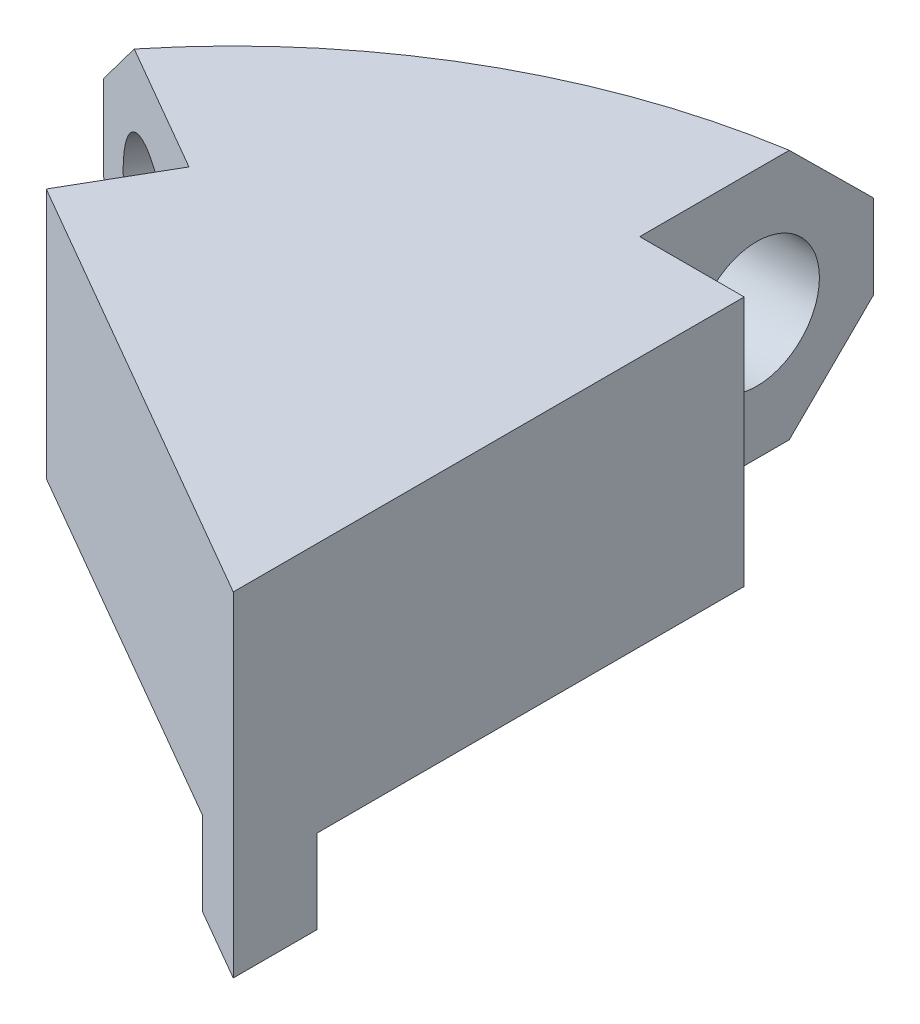
ISO-10303-21;
HEADER;
FILE_DESCRIPTION(('STEP AP214'),'2;1');
FILE_NAME('part.step','',(''),(''),'','','');
FILE_SCHEMA(('AUTOMOTIVE_DESIGN { 1 0 10303 214 1 1 1 1 }'));
ENDSEC;
DATA;
#1=APPLICATION_CONTEXT('core data for automotive mechanical design processes');
#2=APPLICATION_PROTOCOL_DEFINITION('international standard','automotive_design',2000,#1);
#3=PRODUCT_CONTEXT('',#1,'mechanical');
#4=PRODUCT('Part','Part','',(#3));
#5=PRODUCT_RELATED_PRODUCT_CATEGORY('part','',(#4));
#6=PRODUCT_DEFINITION_FORMATION('','',#4);
#7=PRODUCT_DEFINITION_CONTEXT('part definition',#1,'design');
#8=PRODUCT_DEFINITION('design','',#6,#7);
#9=PRODUCT_DEFINITION_SHAPE('','',#8);
#10=(LENGTH_UNIT() NAMED_UNIT(*) SI_UNIT(.MILLI.,.METRE.));
#11=(NAMED_UNIT(*) PLANE_ANGLE_UNIT() SI_UNIT($,.RADIAN.));
#12=(NAMED_UNIT(*) SI_UNIT($,.STERADIAN.) SOLID_ANGLE_UNIT());
#13=UNCERTAINTY_MEASURE_WITH_UNIT(LENGTH_MEASURE(1.E-05),#10,'distance_accuracy_value','');
#14=(GEOMETRIC_REPRESENTATION_CONTEXT(3) GLOBAL_UNCERTAINTY_ASSIGNED_CONTEXT((#13)) GLOBAL_UNIT_ASSIGNED_CONTEXT((#10,
#11,#12)) REPRESENTATION_CONTEXT('',''));
#15=CARTESIAN_POINT('',(0.,0.,0.));
#16=DIRECTION('',(0.,0.,1.));
#17=DIRECTION('',(1.,0.,0.));
#18=AXIS2_PLACEMENT_3D('',#15,#16,#17);
#19=CARTESIAN_POINT('',(-78.3053592074122,15.,-96.422169107235));
#20=DIRECTION('',(0.,0.,1.));
#21=DIRECTION('',(1.,0.,0.));
#22=AXIS2_PLACEMENT_3D('',#19,#20,#21);
#23=PLANE('',#22);
#24=DIRECTION('',(-1.,0.,0.));
#25=VECTOR('',#24,1.);
#26=CARTESIAN_POINT('',(-65.8053592074117,15.,-96.422169107235));
#27=LINE('',#26,#25);
#28=CARTESIAN_POINT('',(-65.8053592074122,15.,-96.422169107235));
#29=VERTEX_POINT('',#28);
#30=CARTESIAN_POINT('',(-78.3053592074122,15.,-96.422169107235));
#31=VERTEX_POINT('',#30);
#32=EDGE_CURVE('E205',#29,#31,#27,.T.);
#33=ORIENTED_EDGE('',*,*,#32,.F.);
#34=DIRECTION('',(0.,1.,0.));
#35=VECTOR('',#34,1.);
#36=CARTESIAN_POINT('',(-65.8053592074122,-15.,-96.422169107235));
#37=LINE('',#36,#35);
#38=CARTESIAN_POINT('',(-65.8053592074122,-15.,-96.422169107235));
#39=VERTEX_POINT('',#38);
#40=EDGE_CURVE('E189',#39,#29,#37,.T.);
#41=ORIENTED_EDGE('',*,*,#40,.F.);
#42=DIRECTION('',(-1.,0.,0.));
#43=VECTOR('',#42,1.);
#44=CARTESIAN_POINT('',(-78.3053592074122,-15.,-96.422169107235));
#45=LINE('',#44,#43);
#46=CARTESIAN_POINT('',(-78.3053592074122,-15.,-96.422169107235));
#47=VERTEX_POINT('',#46);
#48=EDGE_CURVE('E199',#39,#47,#45,.T.);
#49=ORIENTED_EDGE('',*,*,#48,.T.);
#50=DIRECTION('',(0.,-1.,0.));
#51=VECTOR('',#50,1.);
#52=CARTESIAN_POINT('',(-78.3053592074122,15.,-96.422169107235));
#53=LINE('',#52,#51);
#54=EDGE_CURVE('E242',#31,#47,#53,.T.);
#55=ORIENTED_EDGE('',*,*,#54,.F.);
#56=EDGE_LOOP('',(#33,#41,#49,#55));
#57=FACE_BOUND('',#56,.T.);
#58=ADVANCED_FACE('F46',(#57),#23,.F.);
#59=CARTESIAN_POINT('',(-78.3053592074123,15.,-124.422169107236));
#60=DIRECTION('',(-1.,0.,0.));
#61=DIRECTION('',(0.,0.,1.));
#62=AXIS2_PLACEMENT_3D('',#59,#60,#61);
#63=PLANE('',#62);
#64=CARTESIAN_POINT('',(-78.3053592074147,0.,-110.422169107236));
#65=DIRECTION('',(1.,0.,0.));
#66=DIRECTION('',(0.,0.,-1.));
#67=AXIS2_PLACEMENT_3D('',#64,#65,#66);
#68=CIRCLE('',#67,7.5);
#69=CARTESIAN_POINT('',(-78.305359207415,0.,-117.922169107236));
#70=VERTEX_POINT('',#69);
#71=EDGE_CURVE('E173',#70,#70,#68,.T.);
#72=ORIENTED_EDGE('',*,*,#71,.F.);
#73=EDGE_LOOP('',(#72));
#74=FACE_BOUND('',#73,.T.);
#75=DIRECTION('',(0.,-1.,0.));
#76=VECTOR('',#75,1.);
#77=CARTESIAN_POINT('',(-78.3053592074123,15.,-124.422169107236));
#78=LINE('',#77,#76);
#79=CARTESIAN_POINT('',(-78.3053592074123,5.00000000000003,-124.422169107236));
#80=VERTEX_POINT('',#79);
#81=CARTESIAN_POINT('',(-78.3053592074123,-5.00000000000001,-124.422169107236));
#82=VERTEX_POINT('',#81);
#83=EDGE_CURVE('E239',#80,#82,#78,.T.);
#84=ORIENTED_EDGE('',*,*,#83,.F.);
#85=CARTESIAN_POINT('',(-78.3053592074123,5.00000000000003,-124.422169107236));
#86=CARTESIAN_POINT('',(-78.3053592074123,5.83385171149264,-123.580155776792));
#87=CARTESIAN_POINT('',(-78.3053592074123,6.66758915341757,-122.73802927145));
#88=CARTESIAN_POINT('',(-78.3053592074123,8.33481298739111,-121.053527965679));
#89=CARTESIAN_POINT('',(-78.3053592074123,9.16829937946647,-120.211153165275));
#90=CARTESIAN_POINT('',(-78.3053592074123,10.8349987950787,-118.526133130131));
#91=CARTESIAN_POINT('',(-78.3053592074123,11.6682118186108,-117.683487895386));
#92=CARTESIAN_POINT('',(-78.3053592074123,13.3343377368465,-115.997900587824));
#93=CARTESIAN_POINT('',(-78.3053592074123,14.1672506315182,-115.154958514976));
#94=CARTESIAN_POINT('',(-78.3053592074123,15.,-114.311854903752));
#95=B_SPLINE_CURVE_WITH_KNOTS('',3,(#85,#86,#87,#88,#89,#90,#91,#92,#93,#94),.UNSPECIFIED.,.F.,
.F.,(4,2,2,2,4),(0.,3.55508876748459,7.11017715619762,10.6652656062827,14.2203544352882),.UNSPECIFIED.);
#96=CARTESIAN_POINT('',(-78.3053592074123,15.,-114.311854903752));
#97=VERTEX_POINT('',#96);
#98=EDGE_CURVE('E11',#80,#97,#95,.T.);
#99=ORIENTED_EDGE('',*,*,#98,.T.);
#100=DIRECTION('',(0.,0.,-1.));
#101=VECTOR('',#100,1.);
#102=CARTESIAN_POINT('',(-78.3053592074123,15.,-124.422169107236));
#103=LINE('',#102,#101);
#104=EDGE_CURVE('E208',#31,#97,#103,.T.);
#105=ORIENTED_EDGE('',*,*,#104,.F.);
#106=ORIENTED_EDGE('',*,*,#54,.T.);
#107=DIRECTION('',(0.,0.,-1.));
#108=VECTOR('',#107,1.);
#109=CARTESIAN_POINT('',(-78.3053592074123,-15.,-124.422169107236));
#110=LINE('',#109,#108);
#111=CARTESIAN_POINT('',(-78.3053592074123,-15.,-114.311854903752));
#112=VERTEX_POINT('',#111);
#113=EDGE_CURVE('E223',#47,#112,#110,.T.);
#114=ORIENTED_EDGE('',*,*,#113,.T.);
#115=CARTESIAN_POINT('',(-78.3053592074123,-15.,-114.311854903752));
#116=CARTESIAN_POINT('',(-78.3053592074123,-14.1672506315182,-115.154958514976));
#117=CARTESIAN_POINT('',(-78.3053592074123,-13.3343377368466,-115.997900587824));
#118=CARTESIAN_POINT('',(-78.3053592074123,-11.6682118186108,-117.683487895386));
#119=CARTESIAN_POINT('',(-78.3053592074123,-10.8349987950786,-118.526133130131));
#120=CARTESIAN_POINT('',(-78.3053592074123,-9.16829937946645,-120.211153165275));
#121=CARTESIAN_POINT('',(-78.3053592074123,-8.3348129873911,-121.053527965679));
#122=CARTESIAN_POINT('',(-78.3053592074123,-6.66758915341755,-122.73802927145));
#123=CARTESIAN_POINT('',(-78.3053592074123,-5.83385171149262,-123.580155776792));
#124=CARTESIAN_POINT('',(-78.3053592074123,-5.00000000000001,-124.422169107236));
#125=B_SPLINE_CURVE_WITH_KNOTS('',3,(#115,#116,#117,#118,#119,#120,#121,#122,#123,#124),
.UNSPECIFIED.,.F.,.F.,(4,2,2,2,4),(0.,3.55508882900547,7.1101772790906,10.6652656678037,
14.2203544352883),.UNSPECIFIED.);
#126=EDGE_CURVE('E286',#112,#82,#125,.T.);
#127=ORIENTED_EDGE('',*,*,#126,.T.);
#128=EDGE_LOOP('',(#84,#99,#105,#106,#114,#127));
#129=FACE_BOUND('',#128,.T.);
#130=ADVANCED_FACE('F300',(#74,#129),#63,.F.);
#131=CARTESIAN_POINT('',(-65.805359207412,15.,-35.2944517573555));
#132=DIRECTION('',(0.,-1.,0.));
#133=DIRECTION('',(0.,0.,-1.));
#134=AXIS2_PLACEMENT_3D('',#131,#132,#133);
#135=CYLINDRICAL_SURFACE('',#134,90.0000000000009);
#136=DIRECTION('',(0.,-1.,0.));
#137=VECTOR('',#136,1.);
#138=CARTESIAN_POINT('',(-136.742226613727,15.,-90.6836279796011));
#139=LINE('',#138,#137);
#140=CARTESIAN_POINT('',(-136.742226613727,5.00000000000003,-90.6836279796011));
#141=VERTEX_POINT('',#140);
#142=CARTESIAN_POINT('',(-136.742226613727,-5.00000000000001,-90.6836279796011));
#143=VERTEX_POINT('',#142);
#144=EDGE_CURVE('E236',#141,#143,#139,.T.);
#145=ORIENTED_EDGE('',*,*,#144,.F.);
#146=CARTESIAN_POINT('',(-65.805359207412,5.00000000000003,-35.2944517573555));
#147=DIRECTION('',(0.,1.,0.));
#148=DIRECTION('',(0.,0.,1.));
#149=AXIS2_PLACEMENT_3D('',#146,#147,#148);
#150=CIRCLE('',#149,90.0000000000009);
#151=EDGE_CURVE('E62',#141,#80,#150,.F.);
#152=ORIENTED_EDGE('',*,*,#151,.T.);
#153=ORIENTED_EDGE('',*,*,#83,.T.);
#154=CARTESIAN_POINT('',(-65.805359207412,-5.00000000000001,-35.2944517573555));
#155=DIRECTION('',(0.,1.,0.));
#156=DIRECTION('',(0.,0.,1.));
#157=AXIS2_PLACEMENT_3D('',#154,#155,#156);
#158=CIRCLE('',#157,90.0000000000009);
#159=EDGE_CURVE('E246',#82,#143,#158,.T.);
#160=ORIENTED_EDGE('',*,*,#159,.T.);
#161=EDGE_LOOP('',(#145,#152,#153,#160));
#162=FACE_BOUND('',#161,.T.);
#163=ADVANCED_FACE('F270',(#162),#135,.T.);
#164=CARTESIAN_POINT('',(-112.493515307762,15.,-76.6836279796008));
#165=DIRECTION('',(0.499999999999997,0.,-0.86602540378444));
#166=DIRECTION('',(-0.86602540378444,0.,-0.499999999999997));
#167=AXIS2_PLACEMENT_3D('',#164,#165,#166);
#168=PLANE('',#167);
#169=CARTESIAN_POINT('',(-124.617870960745,0.,-83.683627979601));
#170=DIRECTION('',(-0.499999999999997,0.,0.86602540378444));
#171=DIRECTION('',(0.86602540378444,0.,0.499999999999997));
#172=AXIS2_PLACEMENT_3D('',#169,#170,#171);
#173=CIRCLE('',#172,7.50000000000003);
#174=CARTESIAN_POINT('',(-118.122680432362,0.,-79.933627979601));
#175=VERTEX_POINT('',#174);
#176=EDGE_CURVE('E161',#175,#175,#173,.T.);
#177=ORIENTED_EDGE('',*,*,#176,.F.);
#178=EDGE_LOOP('',(#177));
#179=FACE_BOUND('',#178,.T.);
#180=DIRECTION('',(0.86602540378444,0.,0.499999999999997));
#181=VECTOR('',#180,1.);
#182=CARTESIAN_POINT('',(-112.493515307762,15.,-76.6836279796008));
#183=LINE('',#182,#181);
#184=CARTESIAN_POINT('',(-127.986437673268,15.,-85.6284708778592));
#185=VERTEX_POINT('',#184);
#186=CARTESIAN_POINT('',(-112.493515307762,15.,-76.6836279796008));
#187=VERTEX_POINT('',#186);
#188=EDGE_CURVE('E213',#185,#187,#183,.T.);
#189=ORIENTED_EDGE('',*,*,#188,.F.);
#190=CARTESIAN_POINT('',(-127.986437673268,15.,-85.6284708778592));
#191=CARTESIAN_POINT('',(-128.71658681861,14.1672506315182,-86.0500226834713));
#192=CARTESIAN_POINT('',(-129.446596067615,13.3343377368466,-86.4714937198953));
#193=CARTESIAN_POINT('',(-130.90635749626,11.6682118186108,-87.3142873736762));
#194=CARTESIAN_POINT('',(-131.636109675928,10.8349987950787,-87.7356099910489));
#195=CARTESIAN_POINT('',(-133.095379832249,9.16829937946648,-88.578120008621));
#196=CARTESIAN_POINT('',(-133.824897808906,8.33481298739112,-88.9993074088227));
#197=CARTESIAN_POINT('',(-135.283718732412,6.66758915341757,-89.8415580617085));
#198=CARTESIAN_POINT('',(-136.013021679238,5.83385171149264,-90.2626213143793));
#199=CARTESIAN_POINT('',(-136.742226613727,5.00000000000004,-90.6836279796011));
#200=B_SPLINE_CURVE_WITH_KNOTS('',3,(#190,#191,#192,#193,#194,#195,#196,#197,#198,#199),
.UNSPECIFIED.,.F.,.F.,(4,2,2,2,4),(0.,3.55508882900546,7.11017727909057,10.6652656678036,
14.2203544352882),.UNSPECIFIED.);
#201=EDGE_CURVE('E76',#185,#141,#200,.T.);
#202=ORIENTED_EDGE('',*,*,#201,.T.);
#203=ORIENTED_EDGE('',*,*,#144,.T.);
#204=CARTESIAN_POINT('',(-136.742226613727,-5.00000000000001,-90.6836279796011));
#205=CARTESIAN_POINT('',(-136.013021679238,-5.83385171149262,-90.2626213143793));
#206=CARTESIAN_POINT('',(-135.283718732412,-6.66758915341755,-89.8415580617085));
#207=CARTESIAN_POINT('',(-133.824897808906,-8.3348129873911,-88.9993074088227));
#208=CARTESIAN_POINT('',(-133.095379832248,-9.16829937946645,-88.578120008621));
#209=CARTESIAN_POINT('',(-131.636109675928,-10.8349987950786,-87.7356099910489));
#210=CARTESIAN_POINT('',(-130.90635749626,-11.6682118186108,-87.3142873736762));
#211=CARTESIAN_POINT('',(-129.446596067615,-13.3343377368465,-86.4714937198952));
#212=CARTESIAN_POINT('',(-128.71658681861,-14.1672506315182,-86.0500226834713));
#213=CARTESIAN_POINT('',(-127.986437673268,-15.,-85.6284708778592));
#214=B_SPLINE_CURVE_WITH_KNOTS('',3,(#204,#205,#206,#207,#208,#209,#210,#211,#212,#213),
.UNSPECIFIED.,.F.,.F.,(4,2,2,2,4),(0.,3.5550887674846,7.11017715619764,10.6652656062828,
14.2203544352882),.UNSPECIFIED.);
#215=CARTESIAN_POINT('',(-127.986437673268,-15.,-85.6284708778592));
#216=VERTEX_POINT('',#215);
#217=EDGE_CURVE('E250',#143,#216,#214,.T.);
#218=ORIENTED_EDGE('',*,*,#217,.T.);
#219=DIRECTION('',(0.86602540378444,0.,0.499999999999997));
#220=VECTOR('',#219,1.);
#221=CARTESIAN_POINT('',(-112.493515307762,-15.,-76.6836279796008));
#222=LINE('',#221,#220);
#223=CARTESIAN_POINT('',(-112.493515307762,-15.,-76.6836279796008));
#224=VERTEX_POINT('',#223);
#225=EDGE_CURVE('E227',#216,#224,#222,.T.);
#226=ORIENTED_EDGE('',*,*,#225,.T.);
#227=DIRECTION('',(0.,-1.,0.));
#228=VECTOR('',#227,1.);
#229=CARTESIAN_POINT('',(-112.493515307762,15.,-76.6836279796008));
#230=LINE('',#229,#228);
#231=EDGE_CURVE('E220',#187,#224,#230,.T.);
#232=ORIENTED_EDGE('',*,*,#231,.F.);
#233=EDGE_LOOP('',(#189,#202,#203,#218,#226,#232));
#234=FACE_BOUND('',#233,.T.);
#235=ADVANCED_FACE('F264',(#179,#234),#168,.F.);
#236=CARTESIAN_POINT('',(-124.993515307762,15.,-55.0329928849898));
#237=DIRECTION('',(0.866025403784439,0.,0.5));
#238=DIRECTION('',(0.5,0.,-0.866025403784439));
#239=AXIS2_PLACEMENT_3D('',#236,#237,#238);
#240=PLANE('',#239);
#241=DIRECTION('',(-0.5,0.,0.866025403784439));
#242=VECTOR('',#241,1.);
#243=CARTESIAN_POINT('',(-124.993515307762,-15.,-55.0329928849898));
#244=LINE('',#243,#242);
#245=CARTESIAN_POINT('',(-118.743515307762,-15.,-65.8583104322953));
#246=VERTEX_POINT('',#245);
#247=EDGE_CURVE('E209',#224,#246,#244,.T.);
#248=ORIENTED_EDGE('',*,*,#247,.T.);
#249=DIRECTION('',(0.,1.,0.));
#250=VECTOR('',#249,1.);
#251=CARTESIAN_POINT('',(-118.743515307762,-15.,-65.8583104322953));
#252=LINE('',#251,#250);
#253=CARTESIAN_POINT('',(-118.743515307762,15.,-65.8583104322953));
#254=VERTEX_POINT('',#253);
#255=EDGE_CURVE('E195',#246,#254,#252,.T.);
#256=ORIENTED_EDGE('',*,*,#255,.T.);
#257=DIRECTION('',(-0.500000000000001,0.,0.866025403784438));
#258=VECTOR('',#257,1.);
#259=CARTESIAN_POINT('',(-118.743515307762,15.,-65.8583104322953));
#260=LINE('',#259,#258);
#261=EDGE_CURVE('E216',#187,#254,#260,.T.);
#262=ORIENTED_EDGE('',*,*,#261,.F.);
#263=ORIENTED_EDGE('',*,*,#231,.T.);
#264=EDGE_LOOP('',(#248,#256,#262,#263));
#265=FACE_BOUND('',#264,.T.);
#266=ADVANCED_FACE('F269',(#265),#240,.F.);
#267=CARTESIAN_POINT('',(-65.805359207412,15.,-35.2944517573555));
#268=DIRECTION('',(0.,1.,0.));
#269=DIRECTION('',(0.,0.,1.));
#270=AXIS2_PLACEMENT_3D('',#267,#268,#269);
#271=PLANE('',#270);
#272=ORIENTED_EDGE('',*,*,#104,.T.);
#273=CARTESIAN_POINT('',(-65.805359207412,15.,-35.2944517573555));
#274=DIRECTION('',(0.,1.,0.));
#275=DIRECTION('',(0.,0.,1.));
#276=AXIS2_PLACEMENT_3D('',#273,#274,#275);
#277=CIRCLE('',#276,80.0000000000009);
#278=EDGE_CURVE('E281',#97,#185,#277,.T.);
#279=ORIENTED_EDGE('',*,*,#278,.T.);
#280=ORIENTED_EDGE('',*,*,#188,.T.);
#281=ORIENTED_EDGE('',*,*,#261,.T.);
#282=DIRECTION('',(-0.86602540378444,0.,-0.499999999999997));
#283=VECTOR('',#282,1.);
#284=CARTESIAN_POINT('',(-118.743515307762,15.,-65.8583104322953));
#285=LINE('',#284,#283);
#286=CARTESIAN_POINT('',(-65.8053592074122,15.,-35.2944517573559));
#287=VERTEX_POINT('',#286);
#288=EDGE_CURVE('E186',#287,#254,#285,.T.);
#289=ORIENTED_EDGE('',*,*,#288,.F.);
#290=DIRECTION('',(0.,0.,1.));
#291=VECTOR('',#290,1.);
#292=CARTESIAN_POINT('',(-65.8053592074122,15.,-96.422169107235));
#293=LINE('',#292,#291);
#294=EDGE_CURVE('E179',#29,#287,#293,.T.);
#295=ORIENTED_EDGE('',*,*,#294,.F.);
#296=ORIENTED_EDGE('',*,*,#32,.T.);
#297=EDGE_LOOP('',(#272,#279,#280,#281,#289,#295,#296));
#298=FACE_BOUND('',#297,.T.);
#299=ADVANCED_FACE('F308',(#298),#271,.T.);
#300=CARTESIAN_POINT('',(-65.805359207412,-15.,-35.2944517573555));
#301=DIRECTION('',(0.,1.,0.));
#302=DIRECTION('',(0.,0.,1.));
#303=AXIS2_PLACEMENT_3D('',#300,#301,#302);
#304=PLANE('',#303);
#305=ORIENTED_EDGE('',*,*,#225,.F.);
#306=CARTESIAN_POINT('',(-65.805359207412,-15.,-35.2944517573555));
#307=DIRECTION('',(0.,1.,0.));
#308=DIRECTION('',(0.,0.,1.));
#309=AXIS2_PLACEMENT_3D('',#306,#307,#308);
#310=CIRCLE('',#309,80.0000000000008);
#311=EDGE_CURVE('E258',#216,#112,#310,.F.);
#312=ORIENTED_EDGE('',*,*,#311,.T.);
#313=ORIENTED_EDGE('',*,*,#113,.F.);
#314=ORIENTED_EDGE('',*,*,#48,.F.);
#315=DIRECTION('',(0.,0.,1.));
#316=VECTOR('',#315,1.);
#317=CARTESIAN_POINT('',(-65.8053592074122,-15.,-96.422169107235));
#318=LINE('',#317,#316);
#319=CARTESIAN_POINT('',(-65.8053592074122,-15.,-45.2944517573559));
#320=VERTEX_POINT('',#319);
#321=EDGE_CURVE('E183',#39,#320,#318,.T.);
#322=ORIENTED_EDGE('',*,*,#321,.T.);
#323=CARTESIAN_POINT('',(-65.8053592074122,-15.,-35.2944517573559));
#324=DIRECTION('',(0.,-1.,0.));
#325=DIRECTION('',(0.,0.,-1.));
#326=AXIS2_PLACEMENT_3D('',#323,#324,#325);
#327=CIRCLE('',#326,10.);
#328=CARTESIAN_POINT('',(-74.4656132452565,-15.,-40.2944517573559));
#329=VERTEX_POINT('',#328);
#330=EDGE_CURVE('E154',#329,#320,#327,.T.);
#331=ORIENTED_EDGE('',*,*,#330,.F.);
#332=DIRECTION('',(-0.86602540378444,0.,-0.499999999999997));
#333=VECTOR('',#332,1.);
#334=CARTESIAN_POINT('',(-118.743515307762,-15.,-65.8583104322953));
#335=LINE('',#334,#333);
#336=EDGE_CURVE('E159',#329,#246,#335,.T.);
#337=ORIENTED_EDGE('',*,*,#336,.T.);
#338=ORIENTED_EDGE('',*,*,#247,.F.);
#339=EDGE_LOOP('',(#305,#312,#313,#314,#322,#331,#337,#338));
#340=FACE_BOUND('',#339,.T.);
#341=ADVANCED_FACE('F293',(#340),#304,.F.);
#342=CARTESIAN_POINT('',(-118.743515307762,-15.,-65.8583104322953));
#343=DIRECTION('',(0.499999999999997,0.,-0.86602540378444));
#344=DIRECTION('',(-0.86602540378444,0.,-0.499999999999997));
#345=AXIS2_PLACEMENT_3D('',#342,#343,#344);
#346=PLANE('',#345);
#347=ORIENTED_EDGE('',*,*,#288,.T.);
#348=ORIENTED_EDGE('',*,*,#255,.F.);
#349=ORIENTED_EDGE('',*,*,#336,.F.);
#350=DIRECTION('',(0.,1.,0.));
#351=VECTOR('',#350,1.);
#352=CARTESIAN_POINT('',(-74.4656132452565,-25.,-40.2944517573559));
#353=LINE('',#352,#351);
#354=CARTESIAN_POINT('',(-74.4656132452565,-25.,-40.2944517573559));
#355=VERTEX_POINT('',#354);
#356=EDGE_CURVE('E140',#355,#329,#353,.T.);
#357=ORIENTED_EDGE('',*,*,#356,.F.);
#358=DIRECTION('',(-0.866025403784439,0.,-0.5));
#359=VECTOR('',#358,1.);
#360=CARTESIAN_POINT('',(-65.8053592074122,-25.,-35.2944517573559));
#361=LINE('',#360,#359);
#362=CARTESIAN_POINT('',(-65.8053592074122,-25.,-35.2944517573559));
#363=VERTEX_POINT('',#362);
#364=EDGE_CURVE('E148',#363,#355,#361,.T.);
#365=ORIENTED_EDGE('',*,*,#364,.F.);
#366=DIRECTION('',(0.,1.,0.));
#367=VECTOR('',#366,1.);
#368=CARTESIAN_POINT('',(-65.8053592074122,-15.,-35.2944517573559));
#369=LINE('',#368,#367);
#370=EDGE_CURVE('E200',#363,#287,#369,.T.);
#371=ORIENTED_EDGE('',*,*,#370,.T.);
#372=EDGE_LOOP('',(#347,#348,#349,#357,#365,#371));
#373=FACE_BOUND('',#372,.T.);
#374=ADVANCED_FACE('F157',(#373),#346,.F.);
#375=CARTESIAN_POINT('',(-65.8053592074122,-15.,-96.422169107235));
#376=DIRECTION('',(-1.,0.,0.));
#377=DIRECTION('',(0.,0.,1.));
#378=AXIS2_PLACEMENT_3D('',#375,#376,#377);
#379=PLANE('',#378);
#380=ORIENTED_EDGE('',*,*,#294,.T.);
#381=ORIENTED_EDGE('',*,*,#370,.F.);
#382=DIRECTION('',(0.,0.,-1.));
#383=VECTOR('',#382,1.);
#384=CARTESIAN_POINT('',(-65.8053592074122,-25.,-35.2944517573559));
#385=LINE('',#384,#383);
#386=CARTESIAN_POINT('',(-65.8053592074122,-25.,-45.2944517573559));
#387=VERTEX_POINT('',#386);
#388=EDGE_CURVE('E147',#363,#387,#385,.T.);
#389=ORIENTED_EDGE('',*,*,#388,.T.);
#390=DIRECTION('',(0.,1.,0.));
#391=VECTOR('',#390,1.);
#392=CARTESIAN_POINT('',(-65.8053592074122,-25.,-45.2944517573559));
#393=LINE('',#392,#391);
#394=EDGE_CURVE('E142',#387,#320,#393,.T.);
#395=ORIENTED_EDGE('',*,*,#394,.T.);
#396=ORIENTED_EDGE('',*,*,#321,.F.);
#397=ORIENTED_EDGE('',*,*,#40,.T.);
#398=EDGE_LOOP('',(#380,#381,#389,#395,#396,#397));
#399=FACE_BOUND('',#398,.T.);
#400=ADVANCED_FACE('F316',(#399),#379,.F.);
#401=CARTESIAN_POINT('',(-91.3053592074147,0.,-110.422169107236));
#402=DIRECTION('',(1.,0.,0.));
#403=DIRECTION('',(0.,0.,-1.));
#404=AXIS2_PLACEMENT_3D('',#401,#402,#403);
#405=CYLINDRICAL_SURFACE('',#404,7.5);
#406=CARTESIAN_POINT('',(-91.3053592074147,0.,-110.422169107236));
#407=DIRECTION('',(1.,0.,0.));
#408=DIRECTION('',(0.,0.,-1.));
#409=AXIS2_PLACEMENT_3D('',#406,#407,#408);
#410=CIRCLE('',#409,7.5);
#411=CARTESIAN_POINT('',(-91.3053592074149,0.,-117.922169107236));
#412=VERTEX_POINT('',#411);
#413=EDGE_CURVE('E175',#412,#412,#410,.T.);
#414=CARTESIAN_POINT('',(-91.3053592074149,0.,-117.922169107236));
#415=CARTESIAN_POINT('',(-91.1699425407483,0.,-117.922169107236));
#416=CARTESIAN_POINT('',(-91.0345258740816,0.,-117.922169107236));
#417=CARTESIAN_POINT('',(-90.7636925407483,0.,-117.922169107236));
#418=CARTESIAN_POINT('',(-90.6282758740816,0.,-117.922169107236));
#419=CARTESIAN_POINT('',(-90.3574425407483,0.,-117.922169107236));
#420=CARTESIAN_POINT('',(-90.2220258740816,0.,-117.922169107236));
#421=CARTESIAN_POINT('',(-89.9511925407483,0.,-117.922169107236));
#422=CARTESIAN_POINT('',(-89.8157758740816,0.,-117.922169107236));
#423=CARTESIAN_POINT('',(-89.5449425407483,0.,-117.922169107236));
#424=CARTESIAN_POINT('',(-89.4095258740816,0.,-117.922169107236));
#425=CARTESIAN_POINT('',(-89.1386925407483,0.,-117.922169107236));
#426=CARTESIAN_POINT('',(-89.0032758740816,0.,-117.922169107236));
#427=CARTESIAN_POINT('',(-88.7324425407483,0.,-117.922169107236));
#428=CARTESIAN_POINT('',(-88.5970258740816,0.,-117.922169107236));
#429=CARTESIAN_POINT('',(-88.3261925407483,0.,-117.922169107236));
#430=CARTESIAN_POINT('',(-88.1907758740816,0.,-117.922169107236));
#431=CARTESIAN_POINT('',(-87.9199425407483,0.,-117.922169107236));
#432=CARTESIAN_POINT('',(-87.7845258740816,0.,-117.922169107236));
#433=CARTESIAN_POINT('',(-87.5136925407483,0.,-117.922169107236));
#434=CARTESIAN_POINT('',(-87.3782758740816,0.,-117.922169107236));
#435=CARTESIAN_POINT('',(-87.1074425407483,0.,-117.922169107236));
#436=CARTESIAN_POINT('',(-86.9720258740816,0.,-117.922169107236));
#437=CARTESIAN_POINT('',(-86.7011925407483,0.,-117.922169107236));
#438=CARTESIAN_POINT('',(-86.5657758740816,0.,-117.922169107236));
#439=CARTESIAN_POINT('',(-86.2949425407483,0.,-117.922169107236));
#440=CARTESIAN_POINT('',(-86.1595258740816,0.,-117.922169107236));
#441=CARTESIAN_POINT('',(-85.8886925407483,0.,-117.922169107236));
#442=CARTESIAN_POINT('',(-85.7532758740816,0.,-117.922169107236));
#443=CARTESIAN_POINT('',(-85.4824425407483,0.,-117.922169107236));
#444=CARTESIAN_POINT('',(-85.3470258740816,0.,-117.922169107236));
#445=CARTESIAN_POINT('',(-85.0761925407483,0.,-117.922169107236));
#446=CARTESIAN_POINT('',(-84.9407758740816,0.,-117.922169107236));
#447=CARTESIAN_POINT('',(-84.6699425407483,0.,-117.922169107236));
#448=CARTESIAN_POINT('',(-84.5345258740816,0.,-117.922169107236));
#449=CARTESIAN_POINT('',(-84.2636925407483,0.,-117.922169107236));
#450=CARTESIAN_POINT('',(-84.1282758740816,0.,-117.922169107236));
#451=CARTESIAN_POINT('',(-83.8574425407483,0.,-117.922169107236));
#452=CARTESIAN_POINT('',(-83.7220258740816,0.,-117.922169107236));
#453=CARTESIAN_POINT('',(-83.4511925407483,0.,-117.922169107236));
#454=CARTESIAN_POINT('',(-83.3157758740816,0.,-117.922169107236));
#455=CARTESIAN_POINT('',(-83.0449425407483,0.,-117.922169107236));
#456=CARTESIAN_POINT('',(-82.9095258740816,0.,-117.922169107236));
#457=CARTESIAN_POINT('',(-82.6386925407483,0.,-117.922169107236));
#458=CARTESIAN_POINT('',(-82.5032758740816,0.,-117.922169107236));
#459=CARTESIAN_POINT('',(-82.2324425407483,0.,-117.922169107236));
#460=CARTESIAN_POINT('',(-82.0970258740816,0.,-117.922169107236));
#461=CARTESIAN_POINT('',(-81.8261925407483,0.,-117.922169107236));
#462=CARTESIAN_POINT('',(-81.6907758740816,0.,-117.922169107236));
#463=CARTESIAN_POINT('',(-81.4199425407483,0.,-117.922169107236));
#464=CARTESIAN_POINT('',(-81.2845258740816,0.,-117.922169107236));
#465=CARTESIAN_POINT('',(-81.0136925407483,0.,-117.922169107236));
#466=CARTESIAN_POINT('',(-80.8782758740816,0.,-117.922169107236));
#467=CARTESIAN_POINT('',(-80.6074425407483,0.,-117.922169107236));
#468=CARTESIAN_POINT('',(-80.4720258740816,0.,-117.922169107236));
#469=CARTESIAN_POINT('',(-80.2011925407483,0.,-117.922169107236));
#470=CARTESIAN_POINT('',(-80.0657758740816,0.,-117.922169107236));
#471=CARTESIAN_POINT('',(-79.7949425407483,0.,-117.922169107236));
#472=CARTESIAN_POINT('',(-79.6595258740816,0.,-117.922169107236));
#473=CARTESIAN_POINT('',(-79.3886925407483,0.,-117.922169107236));
#474=CARTESIAN_POINT('',(-79.2532758740816,0.,-117.922169107236));
#475=CARTESIAN_POINT('',(-78.9824425407483,0.,-117.922169107236));
#476=CARTESIAN_POINT('',(-78.8470258740816,0.,-117.922169107236));
#477=CARTESIAN_POINT('',(-78.5761925407483,0.,-117.922169107236));
#478=CARTESIAN_POINT('',(-78.4407758740816,0.,-117.922169107236));
#479=CARTESIAN_POINT('',(-78.305359207415,0.,-117.922169107236));
#480=B_SPLINE_CURVE_WITH_KNOTS('',3,(#414,#415,#416,#417,#418,#419,#420,#421,#422,#423,#424,
#425,#426,#427,#428,#429,#430,#431,#432,#433,#434,#435,#436,#437,#438,#439,#440,#441,#442,#443,
#444,#445,#446,#447,#448,#449,#450,#451,#452,#453,#454,#455,#456,#457,#458,#459,#460,#461,#462,
#463,#464,#465,#466,#467,#468,#469,#470,#471,#472,#473,#474,#475,#476,#477,#478,#479),
.UNSPECIFIED.,.F.,.F.,(4,2,2,2,2,2,2,2,2,2,2,2,2,2,2,2,2,2,2,2,2,2,2,2,2,2,2,2,2,2,2,2,4),(0.,
0.406249999999997,0.812499999999994,1.21874999999999,1.62499999999999,2.03125,2.4375,
2.84374999999999,3.24999999999999,3.65624999999999,4.0625,4.46874999999999,4.87499999999999,
5.28124999999999,5.6875,6.09374999999999,6.49999999999999,6.90624999999999,7.31249999999999,
7.71875,8.12499999999999,8.53124999999999,8.93749999999999,9.34374999999998,9.74999999999999,
10.15625,10.5625,10.96875,11.375,11.78125,12.1875,12.59375,13.),.UNSPECIFIED.);
#481=EDGE_CURVE('BSEAM340',#412,#70,#480,.T.);
#482=ORIENTED_EDGE('',*,*,#413,.F.);
#483=ORIENTED_EDGE('',*,*,#71,.T.);
#484=ORIENTED_EDGE('',*,*,#481,.T.);
#485=ORIENTED_EDGE('',*,*,#481,.F.);
#486=EDGE_LOOP('',(#482,#484,#483,#485));
#487=FACE_BOUND('',#486,.T.);
#488=ADVANCED_FACE('F340',(#487),#405,.F.);
#489=CARTESIAN_POINT('',(-91.3053592074147,0.,-110.422169107236));
#490=DIRECTION('',(1.,0.,0.));
#491=DIRECTION('',(0.,0.,-1.));
#492=AXIS2_PLACEMENT_3D('',#489,#490,#491);
#493=PLANE('',#492);
#494=ORIENTED_EDGE('',*,*,#413,.T.);
#495=EDGE_LOOP('',(#494));
#496=FACE_BOUND('',#495,.T.);
#497=ADVANCED_FACE('F342',(#496),#493,.T.);
#498=CARTESIAN_POINT('',(-118.117870960745,0.,-94.9419582287987));
#499=DIRECTION('',(-0.499999999999997,0.,0.86602540378444));
#500=DIRECTION('',(0.86602540378444,0.,0.499999999999997));
#501=AXIS2_PLACEMENT_3D('',#498,#499,#500);
#502=CYLINDRICAL_SURFACE('',#501,7.50000000000003);
#503=CARTESIAN_POINT('',(-118.117870960745,0.,-94.9419582287987));
#504=DIRECTION('',(-0.499999999999997,0.,0.86602540378444));
#505=DIRECTION('',(0.86602540378444,0.,0.499999999999997));
#506=AXIS2_PLACEMENT_3D('',#503,#504,#505);
#507=CIRCLE('',#506,7.50000000000003);
#508=CARTESIAN_POINT('',(-111.622680432362,0.,-91.1919582287987));
#509=VERTEX_POINT('',#508);
#510=EDGE_CURVE('E166',#509,#509,#507,.T.);
#511=ORIENTED_EDGE('',*,*,#510,.F.);
#512=EDGE_LOOP('',(#511));
#513=FACE_BOUND('',#512,.T.);
#514=ORIENTED_EDGE('',*,*,#176,.T.);
#515=EDGE_LOOP('',(#514));
#516=FACE_BOUND('',#515,.T.);
#517=ADVANCED_FACE('F348',(#513,#516),#502,.F.);
#518=CARTESIAN_POINT('',(-118.117870960745,0.,-94.9419582287987));
#519=DIRECTION('',(-0.499999999999997,0.,0.86602540378444));
#520=DIRECTION('',(0.86602540378444,0.,0.499999999999997));
#521=AXIS2_PLACEMENT_3D('',#518,#519,#520);
#522=PLANE('',#521);
#523=ORIENTED_EDGE('',*,*,#510,.T.);
#524=EDGE_LOOP('',(#523));
#525=FACE_BOUND('',#524,.T.);
#526=ADVANCED_FACE('F448',(#525),#522,.T.);
#527=CARTESIAN_POINT('',(-65.8053592074122,-25.,-35.2944517573559));
#528=DIRECTION('',(0.,1.,0.));
#529=DIRECTION('',(0.,0.,1.));
#530=AXIS2_PLACEMENT_3D('',#527,#528,#529);
#531=CYLINDRICAL_SURFACE('',#530,10.);
#532=ORIENTED_EDGE('',*,*,#330,.T.);
#533=ORIENTED_EDGE('',*,*,#394,.F.);
#534=CARTESIAN_POINT('',(-65.8053592074122,-25.,-35.2944517573559));
#535=DIRECTION('',(0.,-1.,0.));
#536=DIRECTION('',(0.,0.,-1.));
#537=AXIS2_PLACEMENT_3D('',#534,#535,#536);
#538=CIRCLE('',#537,10.);
#539=EDGE_CURVE('E135',#355,#387,#538,.T.);
#540=ORIENTED_EDGE('',*,*,#539,.F.);
#541=ORIENTED_EDGE('',*,*,#356,.T.);
#542=EDGE_LOOP('',(#532,#533,#540,#541));
#543=FACE_BOUND('',#542,.T.);
#544=ADVANCED_FACE('F138',(#543),#531,.T.);
#545=CARTESIAN_POINT('',(-65.8053592074122,-25.,-35.2944517573559));
#546=DIRECTION('',(0.,-1.,0.));
#547=DIRECTION('',(0.,0.,-1.));
#548=AXIS2_PLACEMENT_3D('',#545,#546,#547);
#549=PLANE('',#548);
#550=ORIENTED_EDGE('',*,*,#364,.T.);
#551=ORIENTED_EDGE('',*,*,#539,.T.);
#552=ORIENTED_EDGE('',*,*,#388,.F.);
#553=EDGE_LOOP('',(#550,#551,#552));
#554=FACE_BOUND('',#553,.T.);
#555=ADVANCED_FACE('F151',(#554),#549,.T.);
#556=CARTESIAN_POINT('',(-65.805359207412,-5.00000000000001,-35.2944517573555));
#557=DIRECTION('',(0.,1.,0.));
#558=DIRECTION('',(0.,0.,1.));
#559=AXIS2_PLACEMENT_3D('',#556,#557,#558);
#560=CONICAL_SURFACE('',#559,90.0000000000009,0.78539816339745);
#561=ORIENTED_EDGE('',*,*,#126,.F.);
#562=ORIENTED_EDGE('',*,*,#311,.F.);
#563=ORIENTED_EDGE('',*,*,#217,.F.);
#564=ORIENTED_EDGE('',*,*,#159,.F.);
#565=EDGE_LOOP('',(#561,#562,#563,#564));
#566=FACE_BOUND('',#565,.T.);
#567=ADVANCED_FACE('F261',(#566),#560,.T.);
#568=CARTESIAN_POINT('',(-65.805359207412,15.,-35.2944517573555));
#569=DIRECTION('',(0.,-1.,0.));
#570=DIRECTION('',(0.,0.,-1.));
#571=AXIS2_PLACEMENT_3D('',#568,#569,#570);
#572=CONICAL_SURFACE('',#571,80.0000000000009,0.785398163397448);
#573=ORIENTED_EDGE('',*,*,#98,.F.);
#574=ORIENTED_EDGE('',*,*,#151,.F.);
#575=ORIENTED_EDGE('',*,*,#201,.F.);
#576=ORIENTED_EDGE('',*,*,#278,.F.);
#577=EDGE_LOOP('',(#573,#574,#575,#576));
#578=FACE_BOUND('',#577,.T.);
#579=ADVANCED_FACE('F49',(#578),#572,.T.);
#580=CLOSED_SHELL('',(#58,#130,#163,#235,#266,#299,#341,#374,#400,#488,#497,#517,#526,#544,#555,
#567,#579));
#581=MANIFOLD_SOLID_BREP('B2',#580);
#582=ADVANCED_BREP_SHAPE_REPRESENTATION('',(#18,#581),#14);
#583=SHAPE_DEFINITION_REPRESENTATION(#9,#582);
ENDSEC;
END-ISO-10303-21;
